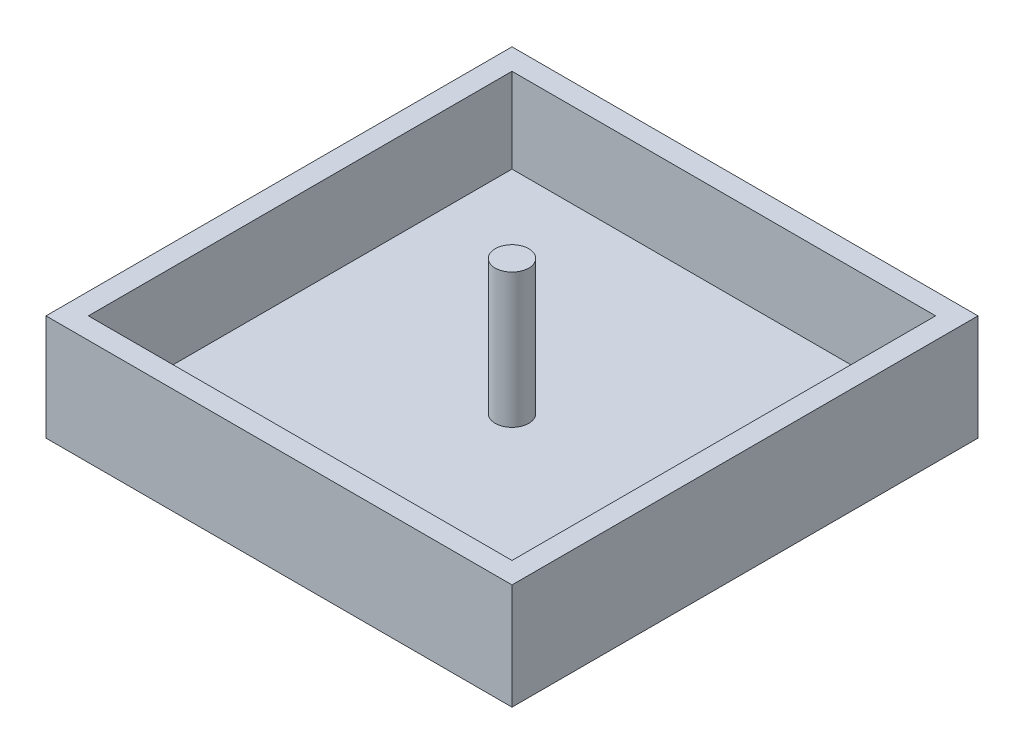
ISO-10303-21;
HEADER;
FILE_DESCRIPTION(('STEP AP214'),'2;1');
FILE_NAME('part.step','',(''),(''),'','','');
FILE_SCHEMA(('AUTOMOTIVE_DESIGN { 1 0 10303 214 1 1 1 1 }'));
ENDSEC;
DATA;
#1=APPLICATION_CONTEXT('core data for automotive mechanical design processes');
#2=APPLICATION_PROTOCOL_DEFINITION('international standard','automotive_design',2000,#1);
#3=PRODUCT_CONTEXT('',#1,'mechanical');
#4=PRODUCT('Part','Part','',(#3));
#5=PRODUCT_RELATED_PRODUCT_CATEGORY('part','',(#4));
#6=PRODUCT_DEFINITION_FORMATION('','',#4);
#7=PRODUCT_DEFINITION_CONTEXT('part definition',#1,'design');
#8=PRODUCT_DEFINITION('design','',#6,#7);
#9=PRODUCT_DEFINITION_SHAPE('','',#8);
#10=(LENGTH_UNIT() NAMED_UNIT(*) SI_UNIT(.MILLI.,.METRE.));
#11=(NAMED_UNIT(*) PLANE_ANGLE_UNIT() SI_UNIT($,.RADIAN.));
#12=(NAMED_UNIT(*) SI_UNIT($,.STERADIAN.) SOLID_ANGLE_UNIT());
#13=UNCERTAINTY_MEASURE_WITH_UNIT(LENGTH_MEASURE(1.E-05),#10,'distance_accuracy_value','');
#14=(GEOMETRIC_REPRESENTATION_CONTEXT(3) GLOBAL_UNCERTAINTY_ASSIGNED_CONTEXT((#13)) GLOBAL_UNIT_ASSIGNED_CONTEXT((#10,
#11,#12)) REPRESENTATION_CONTEXT('',''));
#15=CARTESIAN_POINT('',(0.,0.,0.));
#16=DIRECTION('',(0.,0.,1.));
#17=DIRECTION('',(1.,0.,0.));
#18=AXIS2_PLACEMENT_3D('',#15,#16,#17);
#19=CARTESIAN_POINT('',(0.,2.,0.));
#20=DIRECTION('',(0.,1.,0.));
#21=DIRECTION('',(0.,0.,1.));
#22=AXIS2_PLACEMENT_3D('',#19,#20,#21);
#23=PLANE('',#22);
#24=CARTESIAN_POINT('',(-15.0120625328481,2.,15.0120625328481));
#25=DIRECTION('',(0.,1.,0.));
#26=DIRECTION('',(0.,0.,1.));
#27=AXIS2_PLACEMENT_3D('',#24,#25,#26);
#28=CIRCLE('',#27,1.585);
#29=CARTESIAN_POINT('',(-15.0120625328481,2.,16.5970625328481));
#30=VERTEX_POINT('',#29);
#31=EDGE_CURVE('E135',#30,#30,#28,.T.);
#32=ORIENTED_EDGE('',*,*,#31,.F.);
#33=EDGE_LOOP('',(#32));
#34=FACE_BOUND('',#33,.T.);
#35=DIRECTION('',(0.,0.,1.));
#36=VECTOR('',#35,1.);
#37=CARTESIAN_POINT('',(-35.0120625328481,2.,-4.98793746715188));
#38=LINE('',#37,#36);
#39=CARTESIAN_POINT('',(-35.0120625328481,2.,-4.98793746715188));
#40=VERTEX_POINT('',#39);
#41=CARTESIAN_POINT('',(-35.0120625328481,2.,35.0120625328481));
#42=VERTEX_POINT('',#41);
#43=EDGE_CURVE('E58',#40,#42,#38,.T.);
#44=ORIENTED_EDGE('',*,*,#43,.T.);
#45=DIRECTION('',(1.,0.,0.));
#46=VECTOR('',#45,1.);
#47=CARTESIAN_POINT('',(-35.0120625328481,2.,35.0120625328481));
#48=LINE('',#47,#46);
#49=CARTESIAN_POINT('',(4.98793746715186,2.,35.0120625328481));
#50=VERTEX_POINT('',#49);
#51=EDGE_CURVE('E168',#42,#50,#48,.T.);
#52=ORIENTED_EDGE('',*,*,#51,.T.);
#53=DIRECTION('',(0.,0.,-1.));
#54=VECTOR('',#53,1.);
#55=CARTESIAN_POINT('',(4.98793746715186,2.,-4.98793746715188));
#56=LINE('',#55,#54);
#57=CARTESIAN_POINT('',(4.98793746715186,2.,-4.98793746715188));
#58=VERTEX_POINT('',#57);
#59=EDGE_CURVE('E43',#50,#58,#56,.T.);
#60=ORIENTED_EDGE('',*,*,#59,.T.);
#61=DIRECTION('',(-1.,0.,0.));
#62=VECTOR('',#61,1.);
#63=CARTESIAN_POINT('',(-35.0120625328481,2.,-4.98793746715188));
#64=LINE('',#63,#62);
#65=EDGE_CURVE('E11',#58,#40,#64,.T.);
#66=ORIENTED_EDGE('',*,*,#65,.T.);
#67=EDGE_LOOP('',(#44,#52,#60,#66));
#68=FACE_BOUND('',#67,.T.);
#69=ADVANCED_FACE('F35',(#34,#68),#23,.T.);
#70=CARTESIAN_POINT('',(-35.0120625328481,10.,0.));
#71=DIRECTION('',(-1.,0.,0.));
#72=DIRECTION('',(0.,0.,1.));
#73=AXIS2_PLACEMENT_3D('',#70,#71,#72);
#74=PLANE('',#73);
#75=ORIENTED_EDGE('',*,*,#43,.F.);
#76=DIRECTION('',(0.,-1.,0.));
#77=VECTOR('',#76,1.);
#78=CARTESIAN_POINT('',(-35.0120625328481,10.,-4.98793746715188));
#79=LINE('',#78,#77);
#80=CARTESIAN_POINT('',(-35.0120625328481,10.,-4.98793746715188));
#81=VERTEX_POINT('',#80);
#82=EDGE_CURVE('E154',#81,#40,#79,.T.);
#83=ORIENTED_EDGE('',*,*,#82,.F.);
#84=DIRECTION('',(0.,0.,-1.));
#85=VECTOR('',#84,1.);
#86=CARTESIAN_POINT('',(-35.0120625328481,10.,0.));
#87=LINE('',#86,#85);
#88=CARTESIAN_POINT('',(-35.0120625328481,10.,35.0120625328481));
#89=VERTEX_POINT('',#88);
#90=EDGE_CURVE('E141',#89,#81,#87,.T.);
#91=ORIENTED_EDGE('',*,*,#90,.F.);
#92=DIRECTION('',(0.,-1.,0.));
#93=VECTOR('',#92,1.);
#94=CARTESIAN_POINT('',(-35.0120625328481,10.,35.0120625328481));
#95=LINE('',#94,#93);
#96=EDGE_CURVE('E160',#89,#42,#95,.T.);
#97=ORIENTED_EDGE('',*,*,#96,.T.);
#98=EDGE_LOOP('',(#75,#83,#91,#97));
#99=FACE_BOUND('',#98,.T.);
#100=ADVANCED_FACE('F179',(#99),#74,.F.);
#101=CARTESIAN_POINT('',(0.,10.,-4.98793746715188));
#102=DIRECTION('',(0.,0.,-1.));
#103=DIRECTION('',(-1.,0.,0.));
#104=AXIS2_PLACEMENT_3D('',#101,#102,#103);
#105=PLANE('',#104);
#106=ORIENTED_EDGE('',*,*,#65,.F.);
#107=DIRECTION('',(0.,-1.,0.));
#108=VECTOR('',#107,1.);
#109=CARTESIAN_POINT('',(4.98793746715186,10.,-4.98793746715188));
#110=LINE('',#109,#108);
#111=CARTESIAN_POINT('',(4.98793746715186,10.,-4.98793746715188));
#112=VERTEX_POINT('',#111);
#113=EDGE_CURVE('E156',#112,#58,#110,.T.);
#114=ORIENTED_EDGE('',*,*,#113,.F.);
#115=DIRECTION('',(1.,0.,0.));
#116=VECTOR('',#115,1.);
#117=CARTESIAN_POINT('',(0.,10.,-4.98793746715188));
#118=LINE('',#117,#116);
#119=EDGE_CURVE('E125',#81,#112,#118,.T.);
#120=ORIENTED_EDGE('',*,*,#119,.F.);
#121=ORIENTED_EDGE('',*,*,#82,.T.);
#122=EDGE_LOOP('',(#106,#114,#120,#121));
#123=FACE_BOUND('',#122,.T.);
#124=ADVANCED_FACE('F177',(#123),#105,.F.);
#125=CARTESIAN_POINT('',(4.98793746715186,10.,0.));
#126=DIRECTION('',(1.,0.,0.));
#127=DIRECTION('',(0.,0.,-1.));
#128=AXIS2_PLACEMENT_3D('',#125,#126,#127);
#129=PLANE('',#128);
#130=ORIENTED_EDGE('',*,*,#59,.F.);
#131=DIRECTION('',(0.,-1.,0.));
#132=VECTOR('',#131,1.);
#133=CARTESIAN_POINT('',(4.98793746715186,10.,35.0120625328481));
#134=LINE('',#133,#132);
#135=CARTESIAN_POINT('',(4.98793746715186,10.,35.0120625328481));
#136=VERTEX_POINT('',#135);
#137=EDGE_CURVE('E50',#136,#50,#134,.T.);
#138=ORIENTED_EDGE('',*,*,#137,.F.);
#139=DIRECTION('',(0.,0.,1.));
#140=VECTOR('',#139,1.);
#141=CARTESIAN_POINT('',(4.98793746715186,10.,0.));
#142=LINE('',#141,#140);
#143=EDGE_CURVE('E146',#112,#136,#142,.T.);
#144=ORIENTED_EDGE('',*,*,#143,.F.);
#145=ORIENTED_EDGE('',*,*,#113,.T.);
#146=EDGE_LOOP('',(#130,#138,#144,#145));
#147=FACE_BOUND('',#146,.T.);
#148=ADVANCED_FACE('F173',(#147),#129,.F.);
#149=CARTESIAN_POINT('',(-37.0120625328481,10.,0.));
#150=DIRECTION('',(1.,0.,0.));
#151=DIRECTION('',(0.,0.,-1.));
#152=AXIS2_PLACEMENT_3D('',#149,#150,#151);
#153=PLANE('',#152);
#154=DIRECTION('',(0.,0.,1.));
#155=VECTOR('',#154,1.);
#156=CARTESIAN_POINT('',(-37.0120625328481,0.,0.));
#157=LINE('',#156,#155);
#158=CARTESIAN_POINT('',(-37.0120625328481,0.,-6.98793746715188));
#159=VERTEX_POINT('',#158);
#160=CARTESIAN_POINT('',(-37.0120625328481,0.,37.0120625328481));
#161=VERTEX_POINT('',#160);
#162=EDGE_CURVE('E149',#159,#161,#157,.T.);
#163=ORIENTED_EDGE('',*,*,#162,.T.);
#164=DIRECTION('',(0.,-1.,0.));
#165=VECTOR('',#164,1.);
#166=CARTESIAN_POINT('',(-37.0120625328481,10.,37.0120625328481));
#167=LINE('',#166,#165);
#168=CARTESIAN_POINT('',(-37.0120625328481,10.,37.0120625328481));
#169=VERTEX_POINT('',#168);
#170=EDGE_CURVE('E129',#169,#161,#167,.T.);
#171=ORIENTED_EDGE('',*,*,#170,.F.);
#172=DIRECTION('',(0.,0.,1.));
#173=VECTOR('',#172,1.);
#174=CARTESIAN_POINT('',(-37.0120625328481,10.,0.));
#175=LINE('',#174,#173);
#176=CARTESIAN_POINT('',(-37.0120625328481,10.,-6.98793746715188));
#177=VERTEX_POINT('',#176);
#178=EDGE_CURVE('E108',#177,#169,#175,.T.);
#179=ORIENTED_EDGE('',*,*,#178,.F.);
#180=DIRECTION('',(0.,-1.,0.));
#181=VECTOR('',#180,1.);
#182=CARTESIAN_POINT('',(-37.0120625328481,10.,-6.98793746715188));
#183=LINE('',#182,#181);
#184=EDGE_CURVE('E117',#177,#159,#183,.T.);
#185=ORIENTED_EDGE('',*,*,#184,.T.);
#186=EDGE_LOOP('',(#163,#171,#179,#185));
#187=FACE_BOUND('',#186,.T.);
#188=ADVANCED_FACE('F127',(#187),#153,.F.);
#189=CARTESIAN_POINT('',(0.,10.,37.0120625328481));
#190=DIRECTION('',(0.,0.,-1.));
#191=DIRECTION('',(-1.,0.,0.));
#192=AXIS2_PLACEMENT_3D('',#189,#190,#191);
#193=PLANE('',#192);
#194=DIRECTION('',(1.,0.,0.));
#195=VECTOR('',#194,1.);
#196=CARTESIAN_POINT('',(0.,0.,37.0120625328481));
#197=LINE('',#196,#195);
#198=CARTESIAN_POINT('',(6.98793746715186,0.,37.0120625328481));
#199=VERTEX_POINT('',#198);
#200=EDGE_CURVE('E130',#161,#199,#197,.T.);
#201=ORIENTED_EDGE('',*,*,#200,.T.);
#202=DIRECTION('',(0.,-1.,0.));
#203=VECTOR('',#202,1.);
#204=CARTESIAN_POINT('',(6.98793746715186,10.,37.0120625328481));
#205=LINE('',#204,#203);
#206=CARTESIAN_POINT('',(6.98793746715186,10.,37.0120625328481));
#207=VERTEX_POINT('',#206);
#208=EDGE_CURVE('E163',#207,#199,#205,.T.);
#209=ORIENTED_EDGE('',*,*,#208,.F.);
#210=DIRECTION('',(1.,0.,0.));
#211=VECTOR('',#210,1.);
#212=CARTESIAN_POINT('',(0.,10.,37.0120625328481));
#213=LINE('',#212,#211);
#214=EDGE_CURVE('E139',#169,#207,#213,.T.);
#215=ORIENTED_EDGE('',*,*,#214,.F.);
#216=ORIENTED_EDGE('',*,*,#170,.T.);
#217=EDGE_LOOP('',(#201,#209,#215,#216));
#218=FACE_BOUND('',#217,.T.);
#219=ADVANCED_FACE('F201',(#218),#193,.F.);
#220=CARTESIAN_POINT('',(6.98793746715185,10.,0.));
#221=DIRECTION('',(-1.,0.,0.));
#222=DIRECTION('',(0.,0.,1.));
#223=AXIS2_PLACEMENT_3D('',#220,#221,#222);
#224=PLANE('',#223);
#225=DIRECTION('',(0.,0.,-1.));
#226=VECTOR('',#225,1.);
#227=CARTESIAN_POINT('',(6.98793746715185,0.,0.));
#228=LINE('',#227,#226);
#229=CARTESIAN_POINT('',(6.98793746715186,0.,-6.98793746715188));
#230=VERTEX_POINT('',#229);
#231=EDGE_CURVE('E132',#199,#230,#228,.T.);
#232=ORIENTED_EDGE('',*,*,#231,.T.);
#233=DIRECTION('',(0.,-1.,0.));
#234=VECTOR('',#233,1.);
#235=CARTESIAN_POINT('',(6.98793746715186,10.,-6.98793746715188));
#236=LINE('',#235,#234);
#237=CARTESIAN_POINT('',(6.98793746715186,10.,-6.98793746715188));
#238=VERTEX_POINT('',#237);
#239=EDGE_CURVE('E124',#238,#230,#236,.T.);
#240=ORIENTED_EDGE('',*,*,#239,.F.);
#241=DIRECTION('',(0.,0.,-1.));
#242=VECTOR('',#241,1.);
#243=CARTESIAN_POINT('',(6.98793746715185,10.,0.));
#244=LINE('',#243,#242);
#245=EDGE_CURVE('E111',#207,#238,#244,.T.);
#246=ORIENTED_EDGE('',*,*,#245,.F.);
#247=ORIENTED_EDGE('',*,*,#208,.T.);
#248=EDGE_LOOP('',(#232,#240,#246,#247));
#249=FACE_BOUND('',#248,.T.);
#250=ADVANCED_FACE('F189',(#249),#224,.F.);
#251=CARTESIAN_POINT('',(0.,10.,-6.9879374671518));
#252=DIRECTION('',(0.,0.,1.));
#253=DIRECTION('',(1.,0.,0.));
#254=AXIS2_PLACEMENT_3D('',#251,#252,#253);
#255=PLANE('',#254);
#256=DIRECTION('',(-1.,0.,0.));
#257=VECTOR('',#256,1.);
#258=CARTESIAN_POINT('',(0.,0.,-6.9879374671518));
#259=LINE('',#258,#257);
#260=EDGE_CURVE('E120',#230,#159,#259,.T.);
#261=ORIENTED_EDGE('',*,*,#260,.T.);
#262=ORIENTED_EDGE('',*,*,#184,.F.);
#263=DIRECTION('',(-1.,0.,0.));
#264=VECTOR('',#263,1.);
#265=CARTESIAN_POINT('',(0.,10.,-6.9879374671518));
#266=LINE('',#265,#264);
#267=EDGE_CURVE('E103',#238,#177,#266,.T.);
#268=ORIENTED_EDGE('',*,*,#267,.F.);
#269=ORIENTED_EDGE('',*,*,#239,.T.);
#270=EDGE_LOOP('',(#261,#262,#268,#269));
#271=FACE_BOUND('',#270,.T.);
#272=ADVANCED_FACE('F118',(#271),#255,.F.);
#273=CARTESIAN_POINT('',(0.,10.,35.0120625328481));
#274=DIRECTION('',(0.,0.,1.));
#275=DIRECTION('',(1.,0.,0.));
#276=AXIS2_PLACEMENT_3D('',#273,#274,#275);
#277=PLANE('',#276);
#278=ORIENTED_EDGE('',*,*,#51,.F.);
#279=ORIENTED_EDGE('',*,*,#96,.F.);
#280=DIRECTION('',(-1.,0.,0.));
#281=VECTOR('',#280,1.);
#282=CARTESIAN_POINT('',(0.,10.,35.0120625328481));
#283=LINE('',#282,#281);
#284=EDGE_CURVE('E144',#136,#89,#283,.T.);
#285=ORIENTED_EDGE('',*,*,#284,.F.);
#286=ORIENTED_EDGE('',*,*,#137,.T.);
#287=EDGE_LOOP('',(#278,#279,#285,#286));
#288=FACE_BOUND('',#287,.T.);
#289=ADVANCED_FACE('F181',(#288),#277,.F.);
#290=CARTESIAN_POINT('',(0.,10.,0.));
#291=DIRECTION('',(0.,-1.,0.));
#292=DIRECTION('',(0.,0.,-1.));
#293=AXIS2_PLACEMENT_3D('',#290,#291,#292);
#294=PLANE('',#293);
#295=ORIENTED_EDGE('',*,*,#178,.T.);
#296=ORIENTED_EDGE('',*,*,#214,.T.);
#297=ORIENTED_EDGE('',*,*,#245,.T.);
#298=ORIENTED_EDGE('',*,*,#267,.T.);
#299=EDGE_LOOP('',(#295,#296,#297,#298));
#300=FACE_BOUND('',#299,.T.);
#301=ORIENTED_EDGE('',*,*,#90,.T.);
#302=ORIENTED_EDGE('',*,*,#119,.T.);
#303=ORIENTED_EDGE('',*,*,#143,.T.);
#304=ORIENTED_EDGE('',*,*,#284,.T.);
#305=EDGE_LOOP('',(#301,#302,#303,#304));
#306=FACE_BOUND('',#305,.T.);
#307=ADVANCED_FACE('F105',(#300,#306),#294,.F.);
#308=CARTESIAN_POINT('',(0.,0.,0.));
#309=DIRECTION('',(0.,1.,0.));
#310=DIRECTION('',(0.,0.,1.));
#311=AXIS2_PLACEMENT_3D('',#308,#309,#310);
#312=PLANE('',#311);
#313=ORIENTED_EDGE('',*,*,#162,.F.);
#314=ORIENTED_EDGE('',*,*,#260,.F.);
#315=ORIENTED_EDGE('',*,*,#231,.F.);
#316=ORIENTED_EDGE('',*,*,#200,.F.);
#317=EDGE_LOOP('',(#313,#314,#315,#316));
#318=FACE_BOUND('',#317,.T.);
#319=ADVANCED_FACE('F37',(#318),#312,.F.);
#320=CARTESIAN_POINT('',(-15.0120625328481,14.7,15.0120625328481));
#321=DIRECTION('',(0.,-1.,0.));
#322=DIRECTION('',(0.,0.,-1.));
#323=AXIS2_PLACEMENT_3D('',#320,#321,#322);
#324=CYLINDRICAL_SURFACE('',#323,1.585);
#325=CARTESIAN_POINT('',(-15.0120625328481,14.7,15.0120625328481));
#326=DIRECTION('',(0.,1.,0.));
#327=DIRECTION('',(0.,0.,1.));
#328=AXIS2_PLACEMENT_3D('',#325,#326,#327);
#329=CIRCLE('',#328,1.585);
#330=CARTESIAN_POINT('',(-15.0120625328481,14.7,16.5970625328481));
#331=VERTEX_POINT('',#330);
#332=EDGE_CURVE('E151',#331,#331,#329,.T.);
#333=ORIENTED_EDGE('',*,*,#332,.F.);
#334=EDGE_LOOP('',(#333));
#335=FACE_BOUND('',#334,.T.);
#336=ORIENTED_EDGE('',*,*,#31,.T.);
#337=EDGE_LOOP('',(#336));
#338=FACE_BOUND('',#337,.T.);
#339=ADVANCED_FACE('F214',(#335,#338),#324,.T.);
#340=CARTESIAN_POINT('',(-15.0120625328481,14.7,15.0120625328481));
#341=DIRECTION('',(0.,1.,0.));
#342=DIRECTION('',(0.,0.,1.));
#343=AXIS2_PLACEMENT_3D('',#340,#341,#342);
#344=PLANE('',#343);
#345=ORIENTED_EDGE('',*,*,#332,.T.);
#346=EDGE_LOOP('',(#345));
#347=FACE_BOUND('',#346,.T.);
#348=ADVANCED_FACE('F218',(#347),#344,.T.);
#349=CLOSED_SHELL('',(#69,#100,#124,#148,#188,#219,#250,#272,#289,#307,#319,#339,#348));
#350=MANIFOLD_SOLID_BREP('B2',#349);
#351=ADVANCED_BREP_SHAPE_REPRESENTATION('',(#18,#350),#14);
#352=SHAPE_DEFINITION_REPRESENTATION(#9,#351);
ENDSEC;
END-ISO-10303-21;
